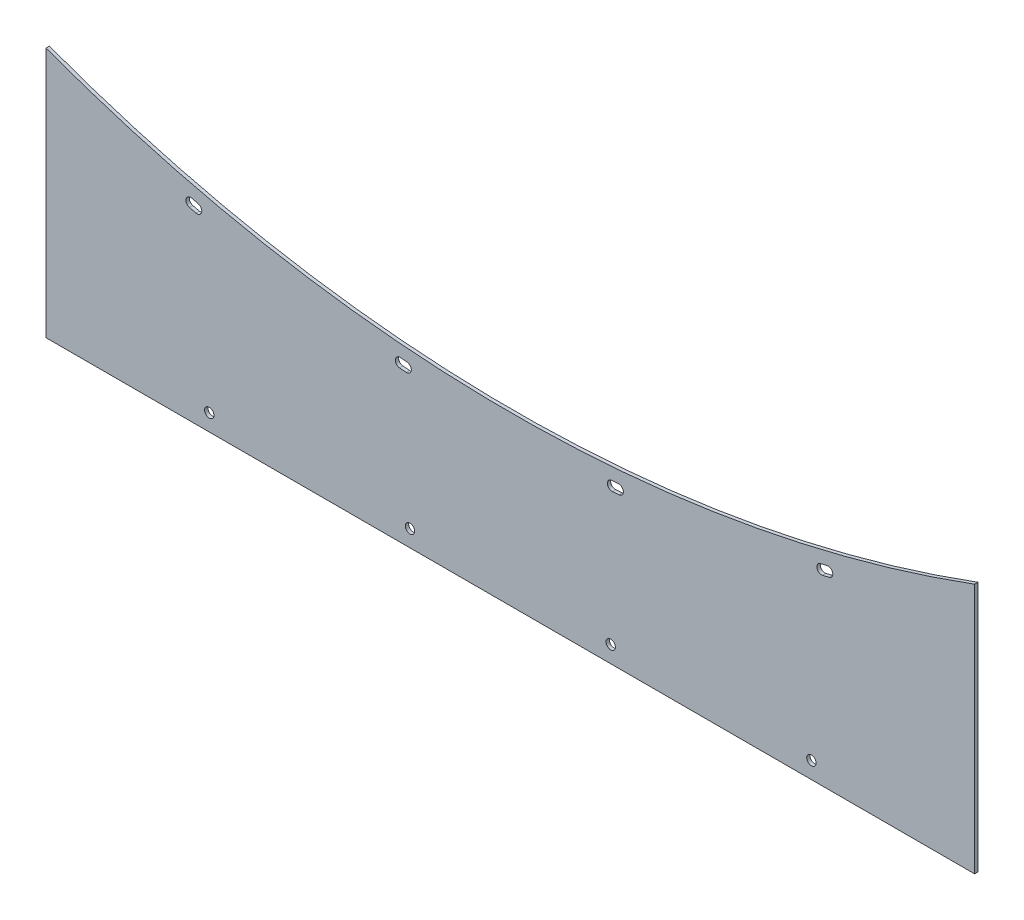
ISO-10303-21;
HEADER;
FILE_DESCRIPTION(('STEP AP214'),'2;1');
FILE_NAME('part.step','',(''),(''),'','','');
FILE_SCHEMA(('AUTOMOTIVE_DESIGN { 1 0 10303 214 1 1 1 1 }'));
ENDSEC;
DATA;
#1=APPLICATION_CONTEXT('core data for automotive mechanical design processes');
#2=APPLICATION_PROTOCOL_DEFINITION('international standard','automotive_design',2000,#1);
#3=PRODUCT_CONTEXT('',#1,'mechanical');
#4=PRODUCT('Part','Part','',(#3));
#5=PRODUCT_RELATED_PRODUCT_CATEGORY('part','',(#4));
#6=PRODUCT_DEFINITION_FORMATION('','',#4);
#7=PRODUCT_DEFINITION_CONTEXT('part definition',#1,'design');
#8=PRODUCT_DEFINITION('design','',#6,#7);
#9=PRODUCT_DEFINITION_SHAPE('','',#8);
#10=(LENGTH_UNIT() NAMED_UNIT(*) SI_UNIT(.MILLI.,.METRE.));
#11=(NAMED_UNIT(*) PLANE_ANGLE_UNIT() SI_UNIT($,.RADIAN.));
#12=(NAMED_UNIT(*) SI_UNIT($,.STERADIAN.) SOLID_ANGLE_UNIT());
#13=UNCERTAINTY_MEASURE_WITH_UNIT(LENGTH_MEASURE(1.E-05),#10,'distance_accuracy_value','');
#14=(GEOMETRIC_REPRESENTATION_CONTEXT(3) GLOBAL_UNCERTAINTY_ASSIGNED_CONTEXT((#13)) GLOBAL_UNIT_ASSIGNED_CONTEXT((#10,
#11,#12)) REPRESENTATION_CONTEXT('',''));
#15=CARTESIAN_POINT('',(0.,0.,0.));
#16=DIRECTION('',(0.,0.,1.));
#17=DIRECTION('',(1.,0.,0.));
#18=AXIS2_PLACEMENT_3D('',#15,#16,#17);
#19=CARTESIAN_POINT('',(957.475381164435,2704.79028939683,5.));
#20=DIRECTION('',(0.,0.,1.));
#21=DIRECTION('',(1.,0.,0.));
#22=AXIS2_PLACEMENT_3D('',#19,#20,#21);
#23=PLANE('',#22);
#24=CARTESIAN_POINT('',(1107.47538116444,484.392203426897,5.));
#25=DIRECTION('',(0.,0.,1.));
#26=DIRECTION('',(1.,0.,0.));
#27=AXIS2_PLACEMENT_3D('',#24,#25,#26);
#28=CIRCLE('',#27,6.9999999999999);
#29=CARTESIAN_POINT('',(1114.47538116444,484.392203426897,5.));
#30=VERTEX_POINT('',#29);
#31=EDGE_CURVE('E305',#30,#30,#28,.T.);
#32=ORIENTED_EDGE('',*,*,#31,.F.);
#33=EDGE_LOOP('',(#32));
#34=FACE_BOUND('',#33,.T.);
#35=CARTESIAN_POINT('',(507.475381164435,484.392203426897,5.));
#36=DIRECTION('',(0.,0.,1.));
#37=DIRECTION('',(1.,0.,0.));
#38=AXIS2_PLACEMENT_3D('',#35,#36,#37);
#39=CIRCLE('',#38,7.00000000000001);
#40=CARTESIAN_POINT('',(514.475381164435,484.392203426897,5.));
#41=VERTEX_POINT('',#40);
#42=EDGE_CURVE('E317',#41,#41,#39,.T.);
#43=ORIENTED_EDGE('',*,*,#42,.F.);
#44=EDGE_LOOP('',(#43));
#45=FACE_BOUND('',#44,.T.);
#46=DIRECTION('',(0.,1.,0.));
#47=VECTOR('',#46,1.);
#48=CARTESIAN_POINT('',(1651.47538116444,459.392203426897,5.));
#49=LINE('',#48,#47);
#50=CARTESIAN_POINT('',(1651.47538116444,459.392203426897,5.));
#51=VERTEX_POINT('',#50);
#52=CARTESIAN_POINT('',(1651.47538116443,834.392203426897,5.));
#53=VERTEX_POINT('',#52);
#54=EDGE_CURVE('E323',#51,#53,#49,.T.);
#55=ORIENTED_EDGE('',*,*,#54,.T.);
#56=CARTESIAN_POINT('',(957.475381164435,2704.79028939683,5.));
#57=DIRECTION('',(0.,0.,-1.));
#58=DIRECTION('',(1.,0.,0.));
#59=AXIS2_PLACEMENT_3D('',#56,#57,#58);
#60=CIRCLE('',#59,1995.);
#61=CARTESIAN_POINT('',(263.475381164435,834.392203426897,5.));
#62=VERTEX_POINT('',#61);
#63=EDGE_CURVE('E326',#53,#62,#60,.T.);
#64=ORIENTED_EDGE('',*,*,#63,.T.);
#65=DIRECTION('',(0.,-1.,0.));
#66=VECTOR('',#65,1.);
#67=CARTESIAN_POINT('',(263.475381164435,459.392203426897,5.));
#68=LINE('',#67,#66);
#69=CARTESIAN_POINT('',(263.475381164435,459.392203426897,5.));
#70=VERTEX_POINT('',#69);
#71=EDGE_CURVE('E329',#62,#70,#68,.T.);
#72=ORIENTED_EDGE('',*,*,#71,.T.);
#73=DIRECTION('',(1.,0.,0.));
#74=VECTOR('',#73,1.);
#75=CARTESIAN_POINT('',(1651.47538116444,459.392203426897,5.));
#76=LINE('',#75,#74);
#77=EDGE_CURVE('E331',#70,#51,#76,.T.);
#78=ORIENTED_EDGE('',*,*,#77,.T.);
#79=EDGE_LOOP('',(#55,#64,#72,#78));
#80=FACE_BOUND('',#79,.T.);
#81=CARTESIAN_POINT('',(807.475381164435,484.392203426897,5.));
#82=DIRECTION('',(0.,0.,1.));
#83=DIRECTION('',(1.,0.,0.));
#84=AXIS2_PLACEMENT_3D('',#81,#82,#83);
#85=CIRCLE('',#84,7.00000000000001);
#86=CARTESIAN_POINT('',(814.475381164435,484.392203426897,5.));
#87=VERTEX_POINT('',#86);
#88=EDGE_CURVE('E311',#87,#87,#85,.T.);
#89=ORIENTED_EDGE('',*,*,#88,.F.);
#90=EDGE_LOOP('',(#89));
#91=FACE_BOUND('',#90,.T.);
#92=CARTESIAN_POINT('',(1407.47538116444,484.392203426897,5.));
#93=DIRECTION('',(0.,0.,1.));
#94=DIRECTION('',(1.,0.,0.));
#95=AXIS2_PLACEMENT_3D('',#92,#93,#94);
#96=CIRCLE('',#95,6.9999999999999);
#97=CARTESIAN_POINT('',(1414.47538116444,484.392203426897,5.));
#98=VERTEX_POINT('',#97);
#99=EDGE_CURVE('E299',#98,#98,#96,.T.);
#100=ORIENTED_EDGE('',*,*,#99,.F.);
#101=EDGE_LOOP('',(#100));
#102=FACE_BOUND('',#101,.T.);
#103=DIRECTION('',(-0.972544560565762,-0.232716732776027,0.));
#104=VECTOR('',#103,1.);
#105=CARTESIAN_POINT('',(1421.07144143981,745.894505314087,5.));
#106=LINE('',#105,#104);
#107=CARTESIAN_POINT('',(1430.79688704546,748.221672641848,5.));
#108=VERTEX_POINT('',#107);
#109=CARTESIAN_POINT('',(1421.07144143981,745.894505314087,5.));
#110=VERTEX_POINT('',#109);
#111=EDGE_CURVE('E270',#108,#110,#106,.T.);
#112=ORIENTED_EDGE('',*,*,#111,.F.);
#113=CARTESIAN_POINT('',(1432.4259041749,741.413860717887,5.));
#114=DIRECTION('',(0.,0.,1.));
#115=DIRECTION('',(1.,0.,0.));
#116=AXIS2_PLACEMENT_3D('',#113,#114,#115);
#117=CIRCLE('',#116,6.99999999999996);
#118=CARTESIAN_POINT('',(1434.05492130433,734.606048793927,5.));
#119=VERTEX_POINT('',#118);
#120=EDGE_CURVE('E268',#119,#108,#117,.T.);
#121=ORIENTED_EDGE('',*,*,#120,.F.);
#122=DIRECTION('',(0.972544560565762,0.232716732776027,0.));
#123=VECTOR('',#122,1.);
#124=CARTESIAN_POINT('',(1434.05492130433,734.606048793927,5.));
#125=LINE('',#124,#123);
#126=CARTESIAN_POINT('',(1424.32947569867,732.278881466166,5.));
#127=VERTEX_POINT('',#126);
#128=EDGE_CURVE('E276',#127,#119,#125,.T.);
#129=ORIENTED_EDGE('',*,*,#128,.F.);
#130=CARTESIAN_POINT('',(1422.70045856924,739.086693390127,5.));
#131=DIRECTION('',(0.,0.,1.));
#132=DIRECTION('',(1.,0.,0.));
#133=AXIS2_PLACEMENT_3D('',#130,#131,#132);
#134=CIRCLE('',#133,6.99999999999996);
#135=EDGE_CURVE('E273',#110,#127,#134,.T.);
#136=ORIENTED_EDGE('',*,*,#135,.F.);
#137=EDGE_LOOP('',(#112,#121,#129,#136));
#138=FACE_BOUND('',#137,.T.);
#139=DIRECTION('',(-0.99697584077775,-0.0777121155644281,0.));
#140=VECTOR('',#139,1.);
#141=CARTESIAN_POINT('',(1108.92499059171,697.489361333398,5.));
#142=LINE('',#141,#140);
#143=CARTESIAN_POINT('',(1118.89474899949,698.266482489043,5.));
#144=VERTEX_POINT('',#143);
#145=CARTESIAN_POINT('',(1108.92499059171,697.489361333399,5.));
#146=VERTEX_POINT('',#145);
#147=EDGE_CURVE('E239',#144,#146,#142,.T.);
#148=ORIENTED_EDGE('',*,*,#147,.F.);
#149=CARTESIAN_POINT('',(1119.43873380844,691.287651603598,5.));
#150=DIRECTION('',(0.,0.,1.));
#151=DIRECTION('',(1.,0.,0.));
#152=AXIS2_PLACEMENT_3D('',#149,#150,#151);
#153=CIRCLE('',#152,7.00000000000005);
#154=CARTESIAN_POINT('',(1119.98271861739,684.308820718154,5.));
#155=VERTEX_POINT('',#154);
#156=EDGE_CURVE('E237',#155,#144,#153,.T.);
#157=ORIENTED_EDGE('',*,*,#156,.F.);
#158=DIRECTION('',(0.996975840777749,0.0777121155644391,0.));
#159=VECTOR('',#158,1.);
#160=CARTESIAN_POINT('',(1119.98271861739,684.308820718154,5.));
#161=LINE('',#160,#159);
#162=CARTESIAN_POINT('',(1110.01296020961,683.53169956251,5.));
#163=VERTEX_POINT('',#162);
#164=EDGE_CURVE('E245',#163,#155,#161,.T.);
#165=ORIENTED_EDGE('',*,*,#164,.F.);
#166=CARTESIAN_POINT('',(1109.46897540066,690.510530447954,5.));
#167=DIRECTION('',(0.,0.,1.));
#168=DIRECTION('',(1.,0.,0.));
#169=AXIS2_PLACEMENT_3D('',#166,#167,#168);
#170=CIRCLE('',#169,7.00000000000011);
#171=EDGE_CURVE('E242',#146,#163,#170,.T.);
#172=ORIENTED_EDGE('',*,*,#171,.F.);
#173=EDGE_LOOP('',(#148,#157,#165,#172));
#174=FACE_BOUND('',#173,.T.);
#175=DIRECTION('',(-0.996858267016683,0.0792060318441365,0.));
#176=VECTOR('',#175,1.);
#177=CARTESIAN_POINT('',(793.049347727083,698.510628051471,5.));
#178=LINE('',#177,#176);
#179=CARTESIAN_POINT('',(803.01793039725,697.71856773303,5.));
#180=VERTEX_POINT('',#179);
#181=CARTESIAN_POINT('',(793.049347727083,698.510628051471,5.));
#182=VERTEX_POINT('',#181);
#183=EDGE_CURVE('E208',#180,#182,#178,.T.);
#184=ORIENTED_EDGE('',*,*,#183,.F.);
#185=CARTESIAN_POINT('',(802.46348817434,690.740559863913,5.));
#186=DIRECTION('',(0.,0.,1.));
#187=DIRECTION('',(1.,0.,0.));
#188=AXIS2_PLACEMENT_3D('',#185,#186,#187);
#189=CIRCLE('',#188,6.99999999999995);
#190=CARTESIAN_POINT('',(801.90904595143,683.762551994796,5.));
#191=VERTEX_POINT('',#190);
#192=EDGE_CURVE('E206',#191,#180,#189,.T.);
#193=ORIENTED_EDGE('',*,*,#192,.F.);
#194=DIRECTION('',(0.996858267016683,-0.0792060318441365,0.));
#195=VECTOR('',#194,1.);
#196=CARTESIAN_POINT('',(801.90904595143,683.762551994796,5.));
#197=LINE('',#196,#195);
#198=CARTESIAN_POINT('',(791.940463281263,684.554612313237,5.));
#199=VERTEX_POINT('',#198);
#200=EDGE_CURVE('E214',#199,#191,#197,.T.);
#201=ORIENTED_EDGE('',*,*,#200,.F.);
#202=CARTESIAN_POINT('',(792.494905504173,691.532620182354,5.));
#203=DIRECTION('',(0.,0.,1.));
#204=DIRECTION('',(1.,0.,0.));
#205=AXIS2_PLACEMENT_3D('',#202,#203,#204);
#206=CIRCLE('',#205,6.99999999999995);
#207=EDGE_CURVE('E211',#182,#199,#206,.T.);
#208=ORIENTED_EDGE('',*,*,#207,.F.);
#209=EDGE_LOOP('',(#184,#193,#201,#208));
#210=FACE_BOUND('',#209,.T.);
#211=DIRECTION('',(-0.972194734338754,0.234173863878954,0.));
#212=VECTOR('',#211,1.);
#213=CARTESIAN_POINT('',(481.222419504398,748.933158492317,5.));
#214=LINE('',#213,#212);
#215=CARTESIAN_POINT('',(490.944366847786,746.591419853528,5.));
#216=VERTEX_POINT('',#215);
#217=CARTESIAN_POINT('',(481.222419504398,748.933158492317,5.));
#218=VERTEX_POINT('',#217);
#219=EDGE_CURVE('E178',#216,#218,#214,.T.);
#220=ORIENTED_EDGE('',*,*,#219,.F.);
#221=CARTESIAN_POINT('',(489.305149800633,739.786056713157,5.));
#222=DIRECTION('',(0.,0.,1.));
#223=DIRECTION('',(1.,0.,0.));
#224=AXIS2_PLACEMENT_3D('',#221,#222,#223);
#225=CIRCLE('',#224,7.00000000000008);
#226=CARTESIAN_POINT('',(487.66593275348,732.980693572785,5.));
#227=VERTEX_POINT('',#226);
#228=EDGE_CURVE('E170',#227,#216,#225,.T.);
#229=ORIENTED_EDGE('',*,*,#228,.F.);
#230=DIRECTION('',(0.972194734338751,-0.234173863878966,0.));
#231=VECTOR('',#230,1.);
#232=CARTESIAN_POINT('',(487.66593275348,732.980693572785,5.));
#233=LINE('',#232,#231);
#234=CARTESIAN_POINT('',(477.943985410092,735.322432211575,5.));
#235=VERTEX_POINT('',#234);
#236=EDGE_CURVE('E192',#235,#227,#233,.T.);
#237=ORIENTED_EDGE('',*,*,#236,.F.);
#238=CARTESIAN_POINT('',(479.583202457245,742.127795351946,5.));
#239=DIRECTION('',(0.,0.,1.));
#240=DIRECTION('',(1.,0.,0.));
#241=AXIS2_PLACEMENT_3D('',#238,#239,#240);
#242=CIRCLE('',#241,7.00000000000002);
#243=EDGE_CURVE('E190',#218,#235,#242,.T.);
#244=ORIENTED_EDGE('',*,*,#243,.F.);
#245=EDGE_LOOP('',(#220,#229,#237,#244));
#246=FACE_BOUND('',#245,.T.);
#247=ADVANCED_FACE('F33',(#34,#45,#80,#91,#102,#138,#174,#210,#246),#23,.T.);
#248=CARTESIAN_POINT('',(957.475381164435,2704.79028939683,0.));
#249=DIRECTION('',(0.,0.,1.));
#250=DIRECTION('',(1.,0.,0.));
#251=AXIS2_PLACEMENT_3D('',#248,#249,#250);
#252=PLANE('',#251);
#253=CARTESIAN_POINT('',(802.46348817434,690.740559863913,0.));
#254=DIRECTION('',(0.,0.,1.));
#255=DIRECTION('',(1.,0.,0.));
#256=AXIS2_PLACEMENT_3D('',#253,#254,#255);
#257=CIRCLE('',#256,6.99999999999995);
#258=CARTESIAN_POINT('',(801.90904595143,683.762551994796,0.));
#259=VERTEX_POINT('',#258);
#260=CARTESIAN_POINT('',(803.01793039725,697.71856773303,0.));
#261=VERTEX_POINT('',#260);
#262=EDGE_CURVE('E186',#259,#261,#257,.T.);
#263=ORIENTED_EDGE('',*,*,#262,.T.);
#264=DIRECTION('',(-0.996858267016683,0.0792060318441365,0.));
#265=VECTOR('',#264,1.);
#266=CARTESIAN_POINT('',(793.049347727083,698.510628051471,0.));
#267=LINE('',#266,#265);
#268=CARTESIAN_POINT('',(793.049347727083,698.510628051471,0.));
#269=VERTEX_POINT('',#268);
#270=EDGE_CURVE('E219',#261,#269,#267,.T.);
#271=ORIENTED_EDGE('',*,*,#270,.T.);
#272=CARTESIAN_POINT('',(792.494905504173,691.532620182354,0.));
#273=DIRECTION('',(0.,0.,1.));
#274=DIRECTION('',(1.,0.,0.));
#275=AXIS2_PLACEMENT_3D('',#272,#273,#274);
#276=CIRCLE('',#275,6.99999999999995);
#277=CARTESIAN_POINT('',(791.940463281263,684.554612313238,0.));
#278=VERTEX_POINT('',#277);
#279=EDGE_CURVE('E222',#269,#278,#276,.T.);
#280=ORIENTED_EDGE('',*,*,#279,.T.);
#281=DIRECTION('',(0.996858267016683,-0.0792060318441365,0.));
#282=VECTOR('',#281,1.);
#283=CARTESIAN_POINT('',(801.90904595143,683.762551994796,0.));
#284=LINE('',#283,#282);
#285=EDGE_CURVE('E209',#278,#259,#284,.T.);
#286=ORIENTED_EDGE('',*,*,#285,.T.);
#287=EDGE_LOOP('',(#263,#271,#280,#286));
#288=FACE_BOUND('',#287,.T.);
#289=CARTESIAN_POINT('',(1432.4259041749,741.413860717887,0.));
#290=DIRECTION('',(0.,0.,1.));
#291=DIRECTION('',(1.,0.,0.));
#292=AXIS2_PLACEMENT_3D('',#289,#290,#291);
#293=CIRCLE('',#292,6.99999999999996);
#294=CARTESIAN_POINT('',(1434.05492130433,734.606048793927,0.));
#295=VERTEX_POINT('',#294);
#296=CARTESIAN_POINT('',(1430.79688704546,748.221672641848,0.));
#297=VERTEX_POINT('',#296);
#298=EDGE_CURVE('E267',#295,#297,#293,.T.);
#299=ORIENTED_EDGE('',*,*,#298,.T.);
#300=DIRECTION('',(-0.972544560565762,-0.232716732776027,0.));
#301=VECTOR('',#300,1.);
#302=CARTESIAN_POINT('',(1421.07144143981,745.894505314087,0.));
#303=LINE('',#302,#301);
#304=CARTESIAN_POINT('',(1421.07144143981,745.894505314087,0.));
#305=VERTEX_POINT('',#304);
#306=EDGE_CURVE('E281',#297,#305,#303,.T.);
#307=ORIENTED_EDGE('',*,*,#306,.T.);
#308=CARTESIAN_POINT('',(1422.70045856924,739.086693390127,0.));
#309=DIRECTION('',(0.,0.,1.));
#310=DIRECTION('',(1.,0.,0.));
#311=AXIS2_PLACEMENT_3D('',#308,#309,#310);
#312=CIRCLE('',#311,6.99999999999996);
#313=CARTESIAN_POINT('',(1424.32947569867,732.278881466166,0.));
#314=VERTEX_POINT('',#313);
#315=EDGE_CURVE('E284',#305,#314,#312,.T.);
#316=ORIENTED_EDGE('',*,*,#315,.T.);
#317=DIRECTION('',(0.972544560565762,0.232716732776027,0.));
#318=VECTOR('',#317,1.);
#319=CARTESIAN_POINT('',(1434.05492130433,734.606048793927,0.));
#320=LINE('',#319,#318);
#321=EDGE_CURVE('E271',#314,#295,#320,.T.);
#322=ORIENTED_EDGE('',*,*,#321,.T.);
#323=EDGE_LOOP('',(#299,#307,#316,#322));
#324=FACE_BOUND('',#323,.T.);
#325=DIRECTION('',(0.,1.,0.));
#326=VECTOR('',#325,1.);
#327=CARTESIAN_POINT('',(1651.47538116444,459.392203426897,0.));
#328=LINE('',#327,#326);
#329=CARTESIAN_POINT('',(1651.47538116444,459.392203426897,0.));
#330=VERTEX_POINT('',#329);
#331=CARTESIAN_POINT('',(1651.47538116443,834.392203426897,0.));
#332=VERTEX_POINT('',#331);
#333=EDGE_CURVE('E320',#330,#332,#328,.T.);
#334=ORIENTED_EDGE('',*,*,#333,.F.);
#335=DIRECTION('',(1.,0.,0.));
#336=VECTOR('',#335,1.);
#337=CARTESIAN_POINT('',(1651.47538116444,459.392203426897,0.));
#338=LINE('',#337,#336);
#339=CARTESIAN_POINT('',(263.475381164435,459.392203426897,0.));
#340=VERTEX_POINT('',#339);
#341=EDGE_CURVE('E327',#340,#330,#338,.T.);
#342=ORIENTED_EDGE('',*,*,#341,.F.);
#343=DIRECTION('',(0.,-1.,0.));
#344=VECTOR('',#343,1.);
#345=CARTESIAN_POINT('',(263.475381164435,459.392203426897,0.));
#346=LINE('',#345,#344);
#347=CARTESIAN_POINT('',(263.475381164435,834.392203426897,0.));
#348=VERTEX_POINT('',#347);
#349=EDGE_CURVE('E338',#348,#340,#346,.T.);
#350=ORIENTED_EDGE('',*,*,#349,.F.);
#351=CARTESIAN_POINT('',(957.475381164435,2704.79028939683,0.));
#352=DIRECTION('',(0.,0.,-1.));
#353=DIRECTION('',(1.,0.,0.));
#354=AXIS2_PLACEMENT_3D('',#351,#352,#353);
#355=CIRCLE('',#354,1995.);
#356=EDGE_CURVE('E336',#332,#348,#355,.T.);
#357=ORIENTED_EDGE('',*,*,#356,.F.);
#358=EDGE_LOOP('',(#334,#342,#350,#357));
#359=FACE_BOUND('',#358,.T.);
#360=CARTESIAN_POINT('',(507.475381164435,484.392203426897,0.));
#361=DIRECTION('',(0.,0.,1.));
#362=DIRECTION('',(1.,0.,0.));
#363=AXIS2_PLACEMENT_3D('',#360,#361,#362);
#364=CIRCLE('',#363,7.00000000000001);
#365=CARTESIAN_POINT('',(514.475381164435,484.392203426897,0.));
#366=VERTEX_POINT('',#365);
#367=EDGE_CURVE('E314',#366,#366,#364,.T.);
#368=ORIENTED_EDGE('',*,*,#367,.T.);
#369=EDGE_LOOP('',(#368));
#370=FACE_BOUND('',#369,.T.);
#371=CARTESIAN_POINT('',(807.475381164435,484.392203426897,0.));
#372=DIRECTION('',(0.,0.,1.));
#373=DIRECTION('',(1.,0.,0.));
#374=AXIS2_PLACEMENT_3D('',#371,#372,#373);
#375=CIRCLE('',#374,7.00000000000001);
#376=CARTESIAN_POINT('',(814.475381164435,484.392203426897,0.));
#377=VERTEX_POINT('',#376);
#378=EDGE_CURVE('E308',#377,#377,#375,.T.);
#379=ORIENTED_EDGE('',*,*,#378,.T.);
#380=EDGE_LOOP('',(#379));
#381=FACE_BOUND('',#380,.T.);
#382=CARTESIAN_POINT('',(1107.47538116444,484.392203426897,0.));
#383=DIRECTION('',(0.,0.,1.));
#384=DIRECTION('',(1.,0.,0.));
#385=AXIS2_PLACEMENT_3D('',#382,#383,#384);
#386=CIRCLE('',#385,6.9999999999999);
#387=CARTESIAN_POINT('',(1114.47538116444,484.392203426897,0.));
#388=VERTEX_POINT('',#387);
#389=EDGE_CURVE('E302',#388,#388,#386,.T.);
#390=ORIENTED_EDGE('',*,*,#389,.T.);
#391=EDGE_LOOP('',(#390));
#392=FACE_BOUND('',#391,.T.);
#393=CARTESIAN_POINT('',(1407.47538116444,484.392203426897,0.));
#394=DIRECTION('',(0.,0.,1.));
#395=DIRECTION('',(1.,0.,0.));
#396=AXIS2_PLACEMENT_3D('',#393,#394,#395);
#397=CIRCLE('',#396,6.9999999999999);
#398=CARTESIAN_POINT('',(1414.47538116444,484.392203426897,0.));
#399=VERTEX_POINT('',#398);
#400=EDGE_CURVE('E298',#399,#399,#397,.T.);
#401=ORIENTED_EDGE('',*,*,#400,.T.);
#402=EDGE_LOOP('',(#401));
#403=FACE_BOUND('',#402,.T.);
#404=CARTESIAN_POINT('',(1119.43873380844,691.287651603598,0.));
#405=DIRECTION('',(0.,0.,1.));
#406=DIRECTION('',(1.,0.,0.));
#407=AXIS2_PLACEMENT_3D('',#404,#405,#406);
#408=CIRCLE('',#407,7.00000000000005);
#409=CARTESIAN_POINT('',(1119.98271861739,684.308820718154,0.));
#410=VERTEX_POINT('',#409);
#411=CARTESIAN_POINT('',(1118.89474899949,698.266482489043,0.));
#412=VERTEX_POINT('',#411);
#413=EDGE_CURVE('E236',#410,#412,#408,.T.);
#414=ORIENTED_EDGE('',*,*,#413,.T.);
#415=DIRECTION('',(-0.99697584077775,-0.0777121155644281,0.));
#416=VECTOR('',#415,1.);
#417=CARTESIAN_POINT('',(1108.92499059171,697.489361333398,0.));
#418=LINE('',#417,#416);
#419=CARTESIAN_POINT('',(1108.92499059171,697.489361333399,0.));
#420=VERTEX_POINT('',#419);
#421=EDGE_CURVE('E250',#412,#420,#418,.T.);
#422=ORIENTED_EDGE('',*,*,#421,.T.);
#423=CARTESIAN_POINT('',(1109.46897540066,690.510530447954,0.));
#424=DIRECTION('',(0.,0.,1.));
#425=DIRECTION('',(1.,0.,0.));
#426=AXIS2_PLACEMENT_3D('',#423,#424,#425);
#427=CIRCLE('',#426,7.00000000000011);
#428=CARTESIAN_POINT('',(1110.01296020961,683.53169956251,0.));
#429=VERTEX_POINT('',#428);
#430=EDGE_CURVE('E253',#420,#429,#427,.T.);
#431=ORIENTED_EDGE('',*,*,#430,.T.);
#432=DIRECTION('',(0.996975840777749,0.0777121155644391,0.));
#433=VECTOR('',#432,1.);
#434=CARTESIAN_POINT('',(1119.98271861739,684.308820718154,0.));
#435=LINE('',#434,#433);
#436=EDGE_CURVE('E240',#429,#410,#435,.T.);
#437=ORIENTED_EDGE('',*,*,#436,.T.);
#438=EDGE_LOOP('',(#414,#422,#431,#437));
#439=FACE_BOUND('',#438,.T.);
#440=CARTESIAN_POINT('',(489.305149800633,739.786056713157,0.));
#441=DIRECTION('',(0.,0.,1.));
#442=DIRECTION('',(1.,0.,0.));
#443=AXIS2_PLACEMENT_3D('',#440,#441,#442);
#444=CIRCLE('',#443,7.00000000000008);
#445=CARTESIAN_POINT('',(487.66593275348,732.980693572785,0.));
#446=VERTEX_POINT('',#445);
#447=CARTESIAN_POINT('',(490.944366847786,746.591419853528,0.));
#448=VERTEX_POINT('',#447);
#449=EDGE_CURVE('E56',#446,#448,#444,.T.);
#450=ORIENTED_EDGE('',*,*,#449,.T.);
#451=DIRECTION('',(-0.972194734338754,0.234173863878954,0.));
#452=VECTOR('',#451,1.);
#453=CARTESIAN_POINT('',(481.222419504398,748.933158492317,0.));
#454=LINE('',#453,#452);
#455=CARTESIAN_POINT('',(481.222419504398,748.933158492317,0.));
#456=VERTEX_POINT('',#455);
#457=EDGE_CURVE('E185',#448,#456,#454,.T.);
#458=ORIENTED_EDGE('',*,*,#457,.T.);
#459=CARTESIAN_POINT('',(479.583202457245,742.127795351946,0.));
#460=DIRECTION('',(0.,0.,1.));
#461=DIRECTION('',(1.,0.,0.));
#462=AXIS2_PLACEMENT_3D('',#459,#460,#461);
#463=CIRCLE('',#462,7.00000000000002);
#464=CARTESIAN_POINT('',(477.943985410092,735.322432211575,0.));
#465=VERTEX_POINT('',#464);
#466=EDGE_CURVE('E198',#456,#465,#463,.T.);
#467=ORIENTED_EDGE('',*,*,#466,.T.);
#468=DIRECTION('',(0.972194734338751,-0.234173863878966,0.));
#469=VECTOR('',#468,1.);
#470=CARTESIAN_POINT('',(487.66593275348,732.980693572785,0.));
#471=LINE('',#470,#469);
#472=EDGE_CURVE('E179',#465,#446,#471,.T.);
#473=ORIENTED_EDGE('',*,*,#472,.T.);
#474=EDGE_LOOP('',(#450,#458,#467,#473));
#475=FACE_BOUND('',#474,.T.);
#476=ADVANCED_FACE('F356',(#288,#324,#359,#370,#381,#392,#403,#439,#475),#252,.F.);
#477=CARTESIAN_POINT('',(1651.47538116444,459.392203426897,5.));
#478=DIRECTION('',(-1.,0.,0.));
#479=DIRECTION('',(0.,-1.,0.));
#480=AXIS2_PLACEMENT_3D('',#477,#478,#479);
#481=PLANE('',#480);
#482=ORIENTED_EDGE('',*,*,#333,.T.);
#483=DIRECTION('',(0.,0.,-1.));
#484=VECTOR('',#483,1.);
#485=CARTESIAN_POINT('',(1651.47538116443,834.392203426897,5.));
#486=LINE('',#485,#484);
#487=EDGE_CURVE('E11',#53,#332,#486,.T.);
#488=ORIENTED_EDGE('',*,*,#487,.F.);
#489=ORIENTED_EDGE('',*,*,#54,.F.);
#490=DIRECTION('',(0.,0.,-1.));
#491=VECTOR('',#490,1.);
#492=CARTESIAN_POINT('',(1651.47538116444,459.392203426897,5.));
#493=LINE('',#492,#491);
#494=EDGE_CURVE('E333',#51,#330,#493,.T.);
#495=ORIENTED_EDGE('',*,*,#494,.T.);
#496=EDGE_LOOP('',(#482,#488,#489,#495));
#497=FACE_BOUND('',#496,.T.);
#498=ADVANCED_FACE('F35',(#497),#481,.F.);
#499=CARTESIAN_POINT('',(957.475381164435,2704.79028939683,5.));
#500=DIRECTION('',(0.,0.,-1.));
#501=DIRECTION('',(-1.,0.,0.));
#502=AXIS2_PLACEMENT_3D('',#499,#500,#501);
#503=CYLINDRICAL_SURFACE('',#502,1995.);
#504=ORIENTED_EDGE('',*,*,#356,.T.);
#505=DIRECTION('',(0.,0.,-1.));
#506=VECTOR('',#505,1.);
#507=CARTESIAN_POINT('',(263.475381164435,834.392203426897,5.));
#508=LINE('',#507,#506);
#509=EDGE_CURVE('E41',#62,#348,#508,.T.);
#510=ORIENTED_EDGE('',*,*,#509,.F.);
#511=ORIENTED_EDGE('',*,*,#63,.F.);
#512=ORIENTED_EDGE('',*,*,#487,.T.);
#513=EDGE_LOOP('',(#504,#510,#511,#512));
#514=FACE_BOUND('',#513,.T.);
#515=ADVANCED_FACE('F367',(#514),#503,.F.);
#516=CARTESIAN_POINT('',(263.475381164435,459.392203426897,5.));
#517=DIRECTION('',(1.,0.,0.));
#518=DIRECTION('',(0.,0.,-1.));
#519=AXIS2_PLACEMENT_3D('',#516,#517,#518);
#520=PLANE('',#519);
#521=ORIENTED_EDGE('',*,*,#349,.T.);
#522=DIRECTION('',(0.,0.,-1.));
#523=VECTOR('',#522,1.);
#524=CARTESIAN_POINT('',(263.475381164435,459.392203426897,5.));
#525=LINE('',#524,#523);
#526=EDGE_CURVE('E343',#70,#340,#525,.T.);
#527=ORIENTED_EDGE('',*,*,#526,.F.);
#528=ORIENTED_EDGE('',*,*,#71,.F.);
#529=ORIENTED_EDGE('',*,*,#509,.T.);
#530=EDGE_LOOP('',(#521,#527,#528,#529));
#531=FACE_BOUND('',#530,.T.);
#532=ADVANCED_FACE('F350',(#531),#520,.F.);
#533=CARTESIAN_POINT('',(1651.47538116444,459.392203426897,5.));
#534=DIRECTION('',(0.,1.,0.));
#535=DIRECTION('',(0.,0.,1.));
#536=AXIS2_PLACEMENT_3D('',#533,#534,#535);
#537=PLANE('',#536);
#538=ORIENTED_EDGE('',*,*,#341,.T.);
#539=ORIENTED_EDGE('',*,*,#494,.F.);
#540=ORIENTED_EDGE('',*,*,#77,.F.);
#541=ORIENTED_EDGE('',*,*,#526,.T.);
#542=EDGE_LOOP('',(#538,#539,#540,#541));
#543=FACE_BOUND('',#542,.T.);
#544=ADVANCED_FACE('F360',(#543),#537,.F.);
#545=CARTESIAN_POINT('',(507.475381164435,484.392203426897,5.));
#546=DIRECTION('',(0.,0.,-1.));
#547=DIRECTION('',(-1.,0.,0.));
#548=AXIS2_PLACEMENT_3D('',#545,#546,#547);
#549=CYLINDRICAL_SURFACE('',#548,7.00000000000001);
#550=ORIENTED_EDGE('',*,*,#42,.T.);
#551=EDGE_LOOP('',(#550));
#552=FACE_BOUND('',#551,.T.);
#553=ORIENTED_EDGE('',*,*,#367,.F.);
#554=EDGE_LOOP('',(#553));
#555=FACE_BOUND('',#554,.T.);
#556=ADVANCED_FACE('F385',(#552,#555),#549,.F.);
#557=CARTESIAN_POINT('',(807.475381164435,484.392203426897,5.));
#558=DIRECTION('',(0.,0.,-1.));
#559=DIRECTION('',(-1.,0.,0.));
#560=AXIS2_PLACEMENT_3D('',#557,#558,#559);
#561=CYLINDRICAL_SURFACE('',#560,7.00000000000001);
#562=ORIENTED_EDGE('',*,*,#88,.T.);
#563=EDGE_LOOP('',(#562));
#564=FACE_BOUND('',#563,.T.);
#565=ORIENTED_EDGE('',*,*,#378,.F.);
#566=EDGE_LOOP('',(#565));
#567=FACE_BOUND('',#566,.T.);
#568=ADVANCED_FACE('F392',(#564,#567),#561,.F.);
#569=CARTESIAN_POINT('',(1107.47538116444,484.392203426897,5.));
#570=DIRECTION('',(0.,0.,-1.));
#571=DIRECTION('',(-1.,0.,0.));
#572=AXIS2_PLACEMENT_3D('',#569,#570,#571);
#573=CYLINDRICAL_SURFACE('',#572,6.9999999999999);
#574=ORIENTED_EDGE('',*,*,#31,.T.);
#575=EDGE_LOOP('',(#574));
#576=FACE_BOUND('',#575,.T.);
#577=ORIENTED_EDGE('',*,*,#389,.F.);
#578=EDGE_LOOP('',(#577));
#579=FACE_BOUND('',#578,.T.);
#580=ADVANCED_FACE('F397',(#576,#579),#573,.F.);
#581=CARTESIAN_POINT('',(1407.47538116444,484.392203426897,5.));
#582=DIRECTION('',(0.,0.,-1.));
#583=DIRECTION('',(-1.,0.,0.));
#584=AXIS2_PLACEMENT_3D('',#581,#582,#583);
#585=CYLINDRICAL_SURFACE('',#584,6.9999999999999);
#586=ORIENTED_EDGE('',*,*,#99,.T.);
#587=EDGE_LOOP('',(#586));
#588=FACE_BOUND('',#587,.T.);
#589=ORIENTED_EDGE('',*,*,#400,.F.);
#590=EDGE_LOOP('',(#589));
#591=FACE_BOUND('',#590,.T.);
#592=ADVANCED_FACE('F472',(#588,#591),#585,.F.);
#593=CARTESIAN_POINT('',(1432.4259041749,741.413860717887,5.));
#594=DIRECTION('',(0.,0.,-1.));
#595=DIRECTION('',(-1.,0.,0.));
#596=AXIS2_PLACEMENT_3D('',#593,#594,#595);
#597=CYLINDRICAL_SURFACE('',#596,6.99999999999996);
#598=ORIENTED_EDGE('',*,*,#298,.F.);
#599=DIRECTION('',(0.,0.,-1.));
#600=VECTOR('',#599,1.);
#601=CARTESIAN_POINT('',(1434.05492130433,734.606048793927,5.));
#602=LINE('',#601,#600);
#603=EDGE_CURVE('E278',#119,#295,#602,.T.);
#604=ORIENTED_EDGE('',*,*,#603,.F.);
#605=ORIENTED_EDGE('',*,*,#120,.T.);
#606=DIRECTION('',(0.,0.,-1.));
#607=VECTOR('',#606,1.);
#608=CARTESIAN_POINT('',(1430.79688704546,748.221672641848,5.));
#609=LINE('',#608,#607);
#610=EDGE_CURVE('E295',#108,#297,#609,.T.);
#611=ORIENTED_EDGE('',*,*,#610,.T.);
#612=EDGE_LOOP('',(#598,#604,#605,#611));
#613=FACE_BOUND('',#612,.T.);
#614=ADVANCED_FACE('F468',(#613),#597,.F.);
#615=CARTESIAN_POINT('',(1421.07144143981,745.894505314087,5.));
#616=DIRECTION('',(0.232716732776027,-0.972544560565762,0.));
#617=DIRECTION('',(0.972544560565762,0.232716732776027,0.));
#618=AXIS2_PLACEMENT_3D('',#615,#616,#617);
#619=PLANE('',#618);
#620=ORIENTED_EDGE('',*,*,#306,.F.);
#621=ORIENTED_EDGE('',*,*,#610,.F.);
#622=ORIENTED_EDGE('',*,*,#111,.T.);
#623=DIRECTION('',(0.,0.,-1.));
#624=VECTOR('',#623,1.);
#625=CARTESIAN_POINT('',(1421.07144143981,745.894505314087,5.));
#626=LINE('',#625,#624);
#627=EDGE_CURVE('E293',#110,#305,#626,.T.);
#628=ORIENTED_EDGE('',*,*,#627,.T.);
#629=EDGE_LOOP('',(#620,#621,#622,#628));
#630=FACE_BOUND('',#629,.T.);
#631=ADVANCED_FACE('F464',(#630),#619,.T.);
#632=CARTESIAN_POINT('',(1422.70045856924,739.086693390127,5.));
#633=DIRECTION('',(0.,0.,-1.));
#634=DIRECTION('',(-1.,0.,0.));
#635=AXIS2_PLACEMENT_3D('',#632,#633,#634);
#636=CYLINDRICAL_SURFACE('',#635,6.99999999999996);
#637=ORIENTED_EDGE('',*,*,#315,.F.);
#638=ORIENTED_EDGE('',*,*,#627,.F.);
#639=ORIENTED_EDGE('',*,*,#135,.T.);
#640=DIRECTION('',(0.,0.,-1.));
#641=VECTOR('',#640,1.);
#642=CARTESIAN_POINT('',(1424.32947569867,732.278881466166,5.));
#643=LINE('',#642,#641);
#644=EDGE_CURVE('E291',#127,#314,#643,.T.);
#645=ORIENTED_EDGE('',*,*,#644,.T.);
#646=EDGE_LOOP('',(#637,#638,#639,#645));
#647=FACE_BOUND('',#646,.T.);
#648=ADVANCED_FACE('F460',(#647),#636,.F.);
#649=CARTESIAN_POINT('',(1434.05492130433,734.606048793927,5.));
#650=DIRECTION('',(-0.232716732776027,0.972544560565762,0.));
#651=DIRECTION('',(-0.972544560565762,-0.232716732776027,0.));
#652=AXIS2_PLACEMENT_3D('',#649,#650,#651);
#653=PLANE('',#652);
#654=ORIENTED_EDGE('',*,*,#321,.F.);
#655=ORIENTED_EDGE('',*,*,#644,.F.);
#656=ORIENTED_EDGE('',*,*,#128,.T.);
#657=ORIENTED_EDGE('',*,*,#603,.T.);
#658=EDGE_LOOP('',(#654,#655,#656,#657));
#659=FACE_BOUND('',#658,.T.);
#660=ADVANCED_FACE('F456',(#659),#653,.T.);
#661=CARTESIAN_POINT('',(1119.43873380844,691.287651603598,5.));
#662=DIRECTION('',(0.,0.,-1.));
#663=DIRECTION('',(-1.,0.,0.));
#664=AXIS2_PLACEMENT_3D('',#661,#662,#663);
#665=CYLINDRICAL_SURFACE('',#664,7.00000000000005);
#666=ORIENTED_EDGE('',*,*,#413,.F.);
#667=DIRECTION('',(0.,0.,-1.));
#668=VECTOR('',#667,1.);
#669=CARTESIAN_POINT('',(1119.98271861739,684.308820718154,5.));
#670=LINE('',#669,#668);
#671=EDGE_CURVE('E247',#155,#410,#670,.T.);
#672=ORIENTED_EDGE('',*,*,#671,.F.);
#673=ORIENTED_EDGE('',*,*,#156,.T.);
#674=DIRECTION('',(0.,0.,-1.));
#675=VECTOR('',#674,1.);
#676=CARTESIAN_POINT('',(1118.89474899949,698.266482489043,5.));
#677=LINE('',#676,#675);
#678=EDGE_CURVE('E264',#144,#412,#677,.T.);
#679=ORIENTED_EDGE('',*,*,#678,.T.);
#680=EDGE_LOOP('',(#666,#672,#673,#679));
#681=FACE_BOUND('',#680,.T.);
#682=ADVANCED_FACE('F452',(#681),#665,.F.);
#683=CARTESIAN_POINT('',(1108.92499059171,697.489361333398,5.));
#684=DIRECTION('',(0.0777121155644281,-0.99697584077775,0.));
#685=DIRECTION('',(0.99697584077775,0.0777121155644281,0.));
#686=AXIS2_PLACEMENT_3D('',#683,#684,#685);
#687=PLANE('',#686);
#688=ORIENTED_EDGE('',*,*,#421,.F.);
#689=ORIENTED_EDGE('',*,*,#678,.F.);
#690=ORIENTED_EDGE('',*,*,#147,.T.);
#691=DIRECTION('',(0.,0.,-1.));
#692=VECTOR('',#691,1.);
#693=CARTESIAN_POINT('',(1108.92499059171,697.489361333399,5.));
#694=LINE('',#693,#692);
#695=EDGE_CURVE('E262',#146,#420,#694,.T.);
#696=ORIENTED_EDGE('',*,*,#695,.T.);
#697=EDGE_LOOP('',(#688,#689,#690,#696));
#698=FACE_BOUND('',#697,.T.);
#699=ADVANCED_FACE('F448',(#698),#687,.T.);
#700=CARTESIAN_POINT('',(1109.46897540066,690.510530447954,5.));
#701=DIRECTION('',(0.,0.,-1.));
#702=DIRECTION('',(-1.,0.,0.));
#703=AXIS2_PLACEMENT_3D('',#700,#701,#702);
#704=CYLINDRICAL_SURFACE('',#703,7.00000000000011);
#705=ORIENTED_EDGE('',*,*,#430,.F.);
#706=ORIENTED_EDGE('',*,*,#695,.F.);
#707=ORIENTED_EDGE('',*,*,#171,.T.);
#708=DIRECTION('',(0.,0.,-1.));
#709=VECTOR('',#708,1.);
#710=CARTESIAN_POINT('',(1110.01296020961,683.53169956251,5.));
#711=LINE('',#710,#709);
#712=EDGE_CURVE('E260',#163,#429,#711,.T.);
#713=ORIENTED_EDGE('',*,*,#712,.T.);
#714=EDGE_LOOP('',(#705,#706,#707,#713));
#715=FACE_BOUND('',#714,.T.);
#716=ADVANCED_FACE('F444',(#715),#704,.F.);
#717=CARTESIAN_POINT('',(1119.98271861739,684.308820718154,5.));
#718=DIRECTION('',(-0.0777121155644391,0.996975840777749,0.));
#719=DIRECTION('',(-0.996975840777749,-0.0777121155644391,0.));
#720=AXIS2_PLACEMENT_3D('',#717,#718,#719);
#721=PLANE('',#720);
#722=ORIENTED_EDGE('',*,*,#436,.F.);
#723=ORIENTED_EDGE('',*,*,#712,.F.);
#724=ORIENTED_EDGE('',*,*,#164,.T.);
#725=ORIENTED_EDGE('',*,*,#671,.T.);
#726=EDGE_LOOP('',(#722,#723,#724,#725));
#727=FACE_BOUND('',#726,.T.);
#728=ADVANCED_FACE('F440',(#727),#721,.T.);
#729=CARTESIAN_POINT('',(802.46348817434,690.740559863913,5.));
#730=DIRECTION('',(0.,0.,-1.));
#731=DIRECTION('',(-1.,0.,0.));
#732=AXIS2_PLACEMENT_3D('',#729,#730,#731);
#733=CYLINDRICAL_SURFACE('',#732,6.99999999999995);
#734=ORIENTED_EDGE('',*,*,#262,.F.);
#735=DIRECTION('',(0.,0.,-1.));
#736=VECTOR('',#735,1.);
#737=CARTESIAN_POINT('',(801.90904595143,683.762551994796,5.));
#738=LINE('',#737,#736);
#739=EDGE_CURVE('E216',#191,#259,#738,.T.);
#740=ORIENTED_EDGE('',*,*,#739,.F.);
#741=ORIENTED_EDGE('',*,*,#192,.T.);
#742=DIRECTION('',(0.,0.,-1.));
#743=VECTOR('',#742,1.);
#744=CARTESIAN_POINT('',(803.01793039725,697.71856773303,5.));
#745=LINE('',#744,#743);
#746=EDGE_CURVE('E233',#180,#261,#745,.T.);
#747=ORIENTED_EDGE('',*,*,#746,.T.);
#748=EDGE_LOOP('',(#734,#740,#741,#747));
#749=FACE_BOUND('',#748,.T.);
#750=ADVANCED_FACE('F436',(#749),#733,.F.);
#751=CARTESIAN_POINT('',(793.049347727083,698.510628051471,5.));
#752=DIRECTION('',(-0.0792060318441365,-0.996858267016684,0.));
#753=DIRECTION('',(0.996858267016684,-0.0792060318441365,0.));
#754=AXIS2_PLACEMENT_3D('',#751,#752,#753);
#755=PLANE('',#754);
#756=ORIENTED_EDGE('',*,*,#270,.F.);
#757=ORIENTED_EDGE('',*,*,#746,.F.);
#758=ORIENTED_EDGE('',*,*,#183,.T.);
#759=DIRECTION('',(0.,0.,-1.));
#760=VECTOR('',#759,1.);
#761=CARTESIAN_POINT('',(793.049347727083,698.510628051471,5.));
#762=LINE('',#761,#760);
#763=EDGE_CURVE('E231',#182,#269,#762,.T.);
#764=ORIENTED_EDGE('',*,*,#763,.T.);
#765=EDGE_LOOP('',(#756,#757,#758,#764));
#766=FACE_BOUND('',#765,.T.);
#767=ADVANCED_FACE('F432',(#766),#755,.T.);
#768=CARTESIAN_POINT('',(792.494905504173,691.532620182354,5.));
#769=DIRECTION('',(0.,0.,-1.));
#770=DIRECTION('',(-1.,0.,0.));
#771=AXIS2_PLACEMENT_3D('',#768,#769,#770);
#772=CYLINDRICAL_SURFACE('',#771,6.99999999999995);
#773=ORIENTED_EDGE('',*,*,#279,.F.);
#774=ORIENTED_EDGE('',*,*,#763,.F.);
#775=ORIENTED_EDGE('',*,*,#207,.T.);
#776=DIRECTION('',(0.,0.,-1.));
#777=VECTOR('',#776,1.);
#778=CARTESIAN_POINT('',(791.940463281263,684.554612313238,5.));
#779=LINE('',#778,#777);
#780=EDGE_CURVE('E229',#199,#278,#779,.T.);
#781=ORIENTED_EDGE('',*,*,#780,.T.);
#782=EDGE_LOOP('',(#773,#774,#775,#781));
#783=FACE_BOUND('',#782,.T.);
#784=ADVANCED_FACE('F428',(#783),#772,.F.);
#785=CARTESIAN_POINT('',(801.90904595143,683.762551994796,5.));
#786=DIRECTION('',(0.0792060318441365,0.996858267016684,0.));
#787=DIRECTION('',(-0.996858267016684,0.0792060318441365,0.));
#788=AXIS2_PLACEMENT_3D('',#785,#786,#787);
#789=PLANE('',#788);
#790=ORIENTED_EDGE('',*,*,#285,.F.);
#791=ORIENTED_EDGE('',*,*,#780,.F.);
#792=ORIENTED_EDGE('',*,*,#200,.T.);
#793=ORIENTED_EDGE('',*,*,#739,.T.);
#794=EDGE_LOOP('',(#790,#791,#792,#793));
#795=FACE_BOUND('',#794,.T.);
#796=ADVANCED_FACE('F425',(#795),#789,.T.);
#797=CARTESIAN_POINT('',(489.305149800633,739.786056713157,5.));
#798=DIRECTION('',(0.,0.,-1.));
#799=DIRECTION('',(-1.,0.,0.));
#800=AXIS2_PLACEMENT_3D('',#797,#798,#799);
#801=CYLINDRICAL_SURFACE('',#800,7.00000000000008);
#802=ORIENTED_EDGE('',*,*,#449,.F.);
#803=DIRECTION('',(0.,0.,-1.));
#804=VECTOR('',#803,1.);
#805=CARTESIAN_POINT('',(487.66593275348,732.980693572785,5.));
#806=LINE('',#805,#804);
#807=EDGE_CURVE('E174',#227,#446,#806,.T.);
#808=ORIENTED_EDGE('',*,*,#807,.F.);
#809=ORIENTED_EDGE('',*,*,#228,.T.);
#810=DIRECTION('',(0.,0.,-1.));
#811=VECTOR('',#810,1.);
#812=CARTESIAN_POINT('',(490.944366847786,746.591419853528,5.));
#813=LINE('',#812,#811);
#814=EDGE_CURVE('E173',#216,#448,#813,.T.);
#815=ORIENTED_EDGE('',*,*,#814,.T.);
#816=EDGE_LOOP('',(#802,#808,#809,#815));
#817=FACE_BOUND('',#816,.T.);
#818=ADVANCED_FACE('F172',(#817),#801,.F.);
#819=CARTESIAN_POINT('',(481.222419504398,748.933158492317,5.));
#820=DIRECTION('',(-0.234173863878954,-0.972194734338754,0.));
#821=DIRECTION('',(0.972194734338754,-0.234173863878954,0.));
#822=AXIS2_PLACEMENT_3D('',#819,#820,#821);
#823=PLANE('',#822);
#824=ORIENTED_EDGE('',*,*,#457,.F.);
#825=ORIENTED_EDGE('',*,*,#814,.F.);
#826=ORIENTED_EDGE('',*,*,#219,.T.);
#827=DIRECTION('',(0.,0.,-1.));
#828=VECTOR('',#827,1.);
#829=CARTESIAN_POINT('',(481.222419504398,748.933158492317,5.));
#830=LINE('',#829,#828);
#831=EDGE_CURVE('E187',#218,#456,#830,.T.);
#832=ORIENTED_EDGE('',*,*,#831,.T.);
#833=EDGE_LOOP('',(#824,#825,#826,#832));
#834=FACE_BOUND('',#833,.T.);
#835=ADVANCED_FACE('F182',(#834),#823,.T.);
#836=CARTESIAN_POINT('',(479.583202457245,742.127795351946,5.));
#837=DIRECTION('',(0.,0.,-1.));
#838=DIRECTION('',(-1.,0.,0.));
#839=AXIS2_PLACEMENT_3D('',#836,#837,#838);
#840=CYLINDRICAL_SURFACE('',#839,7.00000000000002);
#841=ORIENTED_EDGE('',*,*,#466,.F.);
#842=ORIENTED_EDGE('',*,*,#831,.F.);
#843=ORIENTED_EDGE('',*,*,#243,.T.);
#844=DIRECTION('',(0.,0.,-1.));
#845=VECTOR('',#844,1.);
#846=CARTESIAN_POINT('',(477.943985410092,735.322432211575,5.));
#847=LINE('',#846,#845);
#848=EDGE_CURVE('E48',#235,#465,#847,.T.);
#849=ORIENTED_EDGE('',*,*,#848,.T.);
#850=EDGE_LOOP('',(#841,#842,#843,#849));
#851=FACE_BOUND('',#850,.T.);
#852=ADVANCED_FACE('F413',(#851),#840,.F.);
#853=CARTESIAN_POINT('',(487.66593275348,732.980693572785,5.));
#854=DIRECTION('',(0.234173863878966,0.972194734338751,0.));
#855=DIRECTION('',(-0.972194734338751,0.234173863878966,0.));
#856=AXIS2_PLACEMENT_3D('',#853,#854,#855);
#857=PLANE('',#856);
#858=ORIENTED_EDGE('',*,*,#472,.F.);
#859=ORIENTED_EDGE('',*,*,#848,.F.);
#860=ORIENTED_EDGE('',*,*,#236,.T.);
#861=ORIENTED_EDGE('',*,*,#807,.T.);
#862=EDGE_LOOP('',(#858,#859,#860,#861));
#863=FACE_BOUND('',#862,.T.);
#864=ADVANCED_FACE('F411',(#863),#857,.T.);
#865=CLOSED_SHELL('',(#247,#476,#498,#515,#532,#544,#556,#568,#580,#592,#614,#631,#648,#660,
#682,#699,#716,#728,#750,#767,#784,#796,#818,#835,#852,#864));
#866=MANIFOLD_SOLID_BREP('B2',#865);
#867=ADVANCED_BREP_SHAPE_REPRESENTATION('',(#18,#866),#14);
#868=SHAPE_DEFINITION_REPRESENTATION(#9,#867);
ENDSEC;
END-ISO-10303-21;
